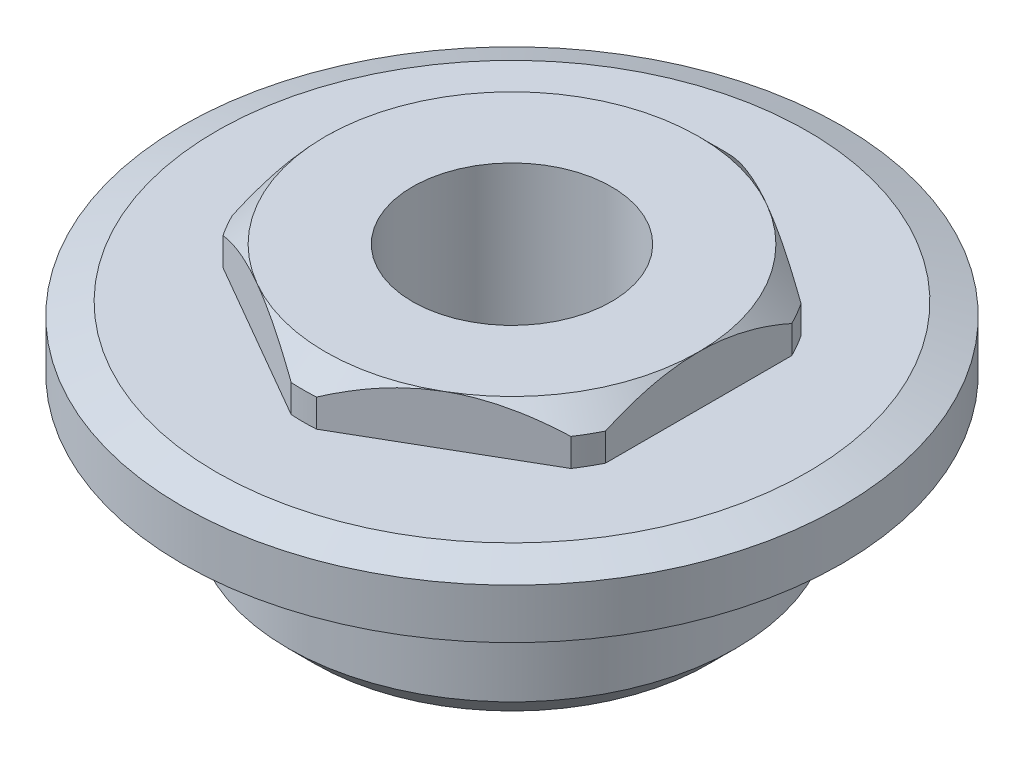
ISO-10303-21;
HEADER;
FILE_DESCRIPTION(('STEP AP214'),'2;1');
FILE_NAME('part.step','',(''),(''),'','','');
FILE_SCHEMA(('AUTOMOTIVE_DESIGN { 1 0 10303 214 1 1 1 1 }'));
ENDSEC;
DATA;
#1=APPLICATION_CONTEXT('core data for automotive mechanical design processes');
#2=APPLICATION_PROTOCOL_DEFINITION('international standard','automotive_design',2000,#1);
#3=PRODUCT_CONTEXT('',#1,'mechanical');
#4=PRODUCT('Part','Part','',(#3));
#5=PRODUCT_RELATED_PRODUCT_CATEGORY('part','',(#4));
#6=PRODUCT_DEFINITION_FORMATION('','',#4);
#7=PRODUCT_DEFINITION_CONTEXT('part definition',#1,'design');
#8=PRODUCT_DEFINITION('design','',#6,#7);
#9=PRODUCT_DEFINITION_SHAPE('','',#8);
#10=(LENGTH_UNIT() NAMED_UNIT(*) SI_UNIT(.MILLI.,.METRE.));
#11=(NAMED_UNIT(*) PLANE_ANGLE_UNIT() SI_UNIT($,.RADIAN.));
#12=(NAMED_UNIT(*) SI_UNIT($,.STERADIAN.) SOLID_ANGLE_UNIT());
#13=UNCERTAINTY_MEASURE_WITH_UNIT(LENGTH_MEASURE(1.E-05),#10,'distance_accuracy_value','');
#14=(GEOMETRIC_REPRESENTATION_CONTEXT(3) GLOBAL_UNCERTAINTY_ASSIGNED_CONTEXT((#13)) GLOBAL_UNIT_ASSIGNED_CONTEXT((#10,
#11,#12)) REPRESENTATION_CONTEXT('',''));
#15=CARTESIAN_POINT('',(0.,0.,0.));
#16=DIRECTION('',(0.,0.,1.));
#17=DIRECTION('',(1.,0.,0.));
#18=AXIS2_PLACEMENT_3D('',#15,#16,#17);
#19=CARTESIAN_POINT('',(0.,0.,0.));
#20=DIRECTION('',(0.,1.,0.));
#21=DIRECTION('',(0.,0.,1.));
#22=AXIS2_PLACEMENT_3D('',#19,#20,#21);
#23=CYLINDRICAL_SURFACE('',#22,16.765);
#24=DIRECTION('',(0.,1.,0.));
#25=VECTOR('',#24,1.);
#26=CARTESIAN_POINT('',(-13.9845137635755,0.,-9.24654528980244));
#27=LINE('',#26,#25);
#28=CARTESIAN_POINT('',(-13.9845137635755,17.3,-9.24654528980244));
#29=VERTEX_POINT('',#28);
#30=CARTESIAN_POINT('',(-13.9845137635755,19.535,-9.24654528980244));
#31=VERTEX_POINT('',#30);
#32=EDGE_CURVE('E173',#29,#31,#27,.T.);
#33=ORIENTED_EDGE('',*,*,#32,.F.);
#34=CARTESIAN_POINT('',(0.,17.3,0.));
#35=DIRECTION('',(0.,1.,0.));
#36=DIRECTION('',(0.,0.,1.));
#37=AXIS2_PLACEMENT_3D('',#34,#35,#36);
#38=CIRCLE('',#37,16.765);
#39=CARTESIAN_POINT('',(-15.,17.3,-7.48767153392829));
#40=VERTEX_POINT('',#39);
#41=EDGE_CURVE('E165',#29,#40,#38,.T.);
#42=ORIENTED_EDGE('',*,*,#41,.T.);
#43=DIRECTION('',(0.,1.,0.));
#44=VECTOR('',#43,1.);
#45=CARTESIAN_POINT('',(-15.,0.,-7.48767153392829));
#46=LINE('',#45,#44);
#47=CARTESIAN_POINT('',(-15.,19.535,-7.48767153392829));
#48=VERTEX_POINT('',#47);
#49=EDGE_CURVE('E146',#48,#40,#46,.F.);
#50=ORIENTED_EDGE('',*,*,#49,.F.);
#51=CARTESIAN_POINT('',(0.,19.535,0.));
#52=DIRECTION('',(0.,1.,0.));
#53=DIRECTION('',(0.,0.,1.));
#54=AXIS2_PLACEMENT_3D('',#51,#52,#53);
#55=CIRCLE('',#54,16.765);
#56=EDGE_CURVE('E305',#31,#48,#55,.T.);
#57=ORIENTED_EDGE('',*,*,#56,.F.);
#58=EDGE_LOOP('',(#33,#42,#50,#57));
#59=FACE_BOUND('',#58,.T.);
#60=ADVANCED_FACE('F37',(#59),#23,.T.);
#61=DIRECTION('',(0.,1.,0.));
#62=VECTOR('',#61,1.);
#63=CARTESIAN_POINT('',(-1.01548623642451,0.,-16.7342168237307));
#64=LINE('',#63,#62);
#65=CARTESIAN_POINT('',(-1.0154862364245,19.535,-16.7342168237307));
#66=VERTEX_POINT('',#65);
#67=CARTESIAN_POINT('',(-1.01548623642451,17.3,-16.7342168237307));
#68=VERTEX_POINT('',#67);
#69=EDGE_CURVE('E337',#66,#68,#64,.F.);
#70=ORIENTED_EDGE('',*,*,#69,.F.);
#71=CARTESIAN_POINT('',(1.0154862364245,19.535,-16.7342168237307));
#72=VERTEX_POINT('',#71);
#73=EDGE_CURVE('E306',#72,#66,#55,.T.);
#74=ORIENTED_EDGE('',*,*,#73,.F.);
#75=DIRECTION('',(0.,1.,0.));
#76=VECTOR('',#75,1.);
#77=CARTESIAN_POINT('',(1.01548623642451,0.,-16.7342168237307));
#78=LINE('',#77,#76);
#79=CARTESIAN_POINT('',(1.01548623642451,17.3,-16.7342168237307));
#80=VERTEX_POINT('',#79);
#81=EDGE_CURVE('E335',#80,#72,#78,.T.);
#82=ORIENTED_EDGE('',*,*,#81,.F.);
#83=EDGE_CURVE('E174',#80,#68,#38,.T.);
#84=ORIENTED_EDGE('',*,*,#83,.T.);
#85=EDGE_LOOP('',(#70,#74,#82,#84));
#86=FACE_BOUND('',#85,.T.);
#87=ADVANCED_FACE('F281',(#86),#23,.T.);
#88=DIRECTION('',(0.,1.,0.));
#89=VECTOR('',#88,1.);
#90=CARTESIAN_POINT('',(13.9845137635755,0.,-9.24654528980244));
#91=LINE('',#90,#89);
#92=CARTESIAN_POINT('',(13.9845137635755,19.535,-9.24654528980244));
#93=VERTEX_POINT('',#92);
#94=CARTESIAN_POINT('',(13.9845137635755,17.3,-9.24654528980244));
#95=VERTEX_POINT('',#94);
#96=EDGE_CURVE('E341',#93,#95,#91,.F.);
#97=ORIENTED_EDGE('',*,*,#96,.F.);
#98=CARTESIAN_POINT('',(15.,19.535,-7.48767153392829));
#99=VERTEX_POINT('',#98);
#100=EDGE_CURVE('E316',#99,#93,#55,.T.);
#101=ORIENTED_EDGE('',*,*,#100,.F.);
#102=DIRECTION('',(0.,1.,0.));
#103=VECTOR('',#102,1.);
#104=CARTESIAN_POINT('',(15.,0.,-7.48767153392829));
#105=LINE('',#104,#103);
#106=CARTESIAN_POINT('',(15.,17.3,-7.48767153392829));
#107=VERTEX_POINT('',#106);
#108=EDGE_CURVE('E345',#107,#99,#105,.T.);
#109=ORIENTED_EDGE('',*,*,#108,.F.);
#110=EDGE_CURVE('E177',#107,#95,#38,.T.);
#111=ORIENTED_EDGE('',*,*,#110,.T.);
#112=EDGE_LOOP('',(#97,#101,#109,#111));
#113=FACE_BOUND('',#112,.T.);
#114=ADVANCED_FACE('F285',(#113),#23,.T.);
#115=DIRECTION('',(0.,1.,0.));
#116=VECTOR('',#115,1.);
#117=CARTESIAN_POINT('',(15.,0.,7.48767153392829));
#118=LINE('',#117,#116);
#119=CARTESIAN_POINT('',(15.,19.535,7.48767153392829));
#120=VERTEX_POINT('',#119);
#121=CARTESIAN_POINT('',(15.,17.3,7.48767153392829));
#122=VERTEX_POINT('',#121);
#123=EDGE_CURVE('E347',#120,#122,#118,.F.);
#124=ORIENTED_EDGE('',*,*,#123,.F.);
#125=CARTESIAN_POINT('',(13.9845137635755,19.535,9.24654528980244));
#126=VERTEX_POINT('',#125);
#127=EDGE_CURVE('E182',#126,#120,#55,.T.);
#128=ORIENTED_EDGE('',*,*,#127,.F.);
#129=DIRECTION('',(0.,1.,0.));
#130=VECTOR('',#129,1.);
#131=CARTESIAN_POINT('',(13.9845137635755,0.,9.24654528980244));
#132=LINE('',#131,#130);
#133=CARTESIAN_POINT('',(13.9845137635755,17.3,9.24654528980244));
#134=VERTEX_POINT('',#133);
#135=EDGE_CURVE('E349',#134,#126,#132,.T.);
#136=ORIENTED_EDGE('',*,*,#135,.F.);
#137=EDGE_CURVE('E183',#134,#122,#38,.T.);
#138=ORIENTED_EDGE('',*,*,#137,.T.);
#139=EDGE_LOOP('',(#124,#128,#136,#138));
#140=FACE_BOUND('',#139,.T.);
#141=ADVANCED_FACE('F293',(#140),#23,.T.);
#142=DIRECTION('',(0.,1.,0.));
#143=VECTOR('',#142,1.);
#144=CARTESIAN_POINT('',(1.01548623642451,0.,16.7342168237307));
#145=LINE('',#144,#143);
#146=CARTESIAN_POINT('',(1.0154862364245,19.535,16.7342168237307));
#147=VERTEX_POINT('',#146);
#148=CARTESIAN_POINT('',(1.01548623642451,17.3,16.7342168237307));
#149=VERTEX_POINT('',#148);
#150=EDGE_CURVE('E351',#147,#149,#145,.F.);
#151=ORIENTED_EDGE('',*,*,#150,.F.);
#152=CARTESIAN_POINT('',(-1.0154862364245,19.535,16.7342168237307));
#153=VERTEX_POINT('',#152);
#154=EDGE_CURVE('E184',#153,#147,#55,.T.);
#155=ORIENTED_EDGE('',*,*,#154,.F.);
#156=DIRECTION('',(0.,1.,0.));
#157=VECTOR('',#156,1.);
#158=CARTESIAN_POINT('',(-1.01548623642451,0.,16.7342168237307));
#159=LINE('',#158,#157);
#160=CARTESIAN_POINT('',(-1.01548623642451,17.3,16.7342168237307));
#161=VERTEX_POINT('',#160);
#162=EDGE_CURVE('E300',#161,#153,#159,.T.);
#163=ORIENTED_EDGE('',*,*,#162,.F.);
#164=EDGE_CURVE('E178',#161,#149,#38,.T.);
#165=ORIENTED_EDGE('',*,*,#164,.T.);
#166=EDGE_LOOP('',(#151,#155,#163,#165));
#167=FACE_BOUND('',#166,.T.);
#168=ADVANCED_FACE('F288',(#167),#23,.T.);
#169=DIRECTION('',(0.,1.,0.));
#170=VECTOR('',#169,1.);
#171=CARTESIAN_POINT('',(-13.9845137635755,0.,9.24654528980244));
#172=LINE('',#171,#170);
#173=CARTESIAN_POINT('',(-13.9845137635755,19.535,9.24654528980244));
#174=VERTEX_POINT('',#173);
#175=CARTESIAN_POINT('',(-13.9845137635755,17.3,9.24654528980244));
#176=VERTEX_POINT('',#175);
#177=EDGE_CURVE('E297',#174,#176,#172,.F.);
#178=ORIENTED_EDGE('',*,*,#177,.F.);
#179=CARTESIAN_POINT('',(-15.,19.535,7.48767153392829));
#180=VERTEX_POINT('',#179);
#181=EDGE_CURVE('E299',#180,#174,#55,.T.);
#182=ORIENTED_EDGE('',*,*,#181,.F.);
#183=DIRECTION('',(0.,1.,0.));
#184=VECTOR('',#183,1.);
#185=CARTESIAN_POINT('',(-15.,0.,7.48767153392829));
#186=LINE('',#185,#184);
#187=CARTESIAN_POINT('',(-15.,17.3,7.48767153392829));
#188=VERTEX_POINT('',#187);
#189=EDGE_CURVE('E156',#188,#180,#186,.T.);
#190=ORIENTED_EDGE('',*,*,#189,.F.);
#191=EDGE_CURVE('E168',#188,#176,#38,.T.);
#192=ORIENTED_EDGE('',*,*,#191,.T.);
#193=EDGE_LOOP('',(#178,#182,#190,#192));
#194=FACE_BOUND('',#193,.T.);
#195=ADVANCED_FACE('F233',(#194),#23,.T.);
#196=CARTESIAN_POINT('',(0.,19.535,0.));
#197=DIRECTION('',(0.,-1.,0.));
#198=DIRECTION('',(0.,0.,-1.));
#199=AXIS2_PLACEMENT_3D('',#196,#197,#198);
#200=CONICAL_SURFACE('',#199,16.765,0.785398163397449);
#201=CARTESIAN_POINT('',(-13.9849015628612,19.5348,-9.24632139378042));
#202=CARTESIAN_POINT('',(-13.7539748505963,19.6538802713569,-9.37964699326966));
#203=CARTESIAN_POINT('',(-13.5214356455137,19.768734285981,-9.51390356592121));
#204=CARTESIAN_POINT('',(-13.0529017099638,19.9889092191457,-9.78441175973544));
#205=CARTESIAN_POINT('',(-12.8169057241301,20.0942265693545,-9.92066410568421));
#206=CARTESIAN_POINT('',(-12.1019807858625,20.3948228354741,-10.3334262112434));
#207=CARTESIAN_POINT('',(-11.6177312426382,20.5738953515338,-10.6130078153789));
#208=CARTESIAN_POINT('',(-10.8850054586592,20.8014534615381,-11.0360472440014));
#209=CARTESIAN_POINT('',(-10.6411582596428,20.8701779719215,-11.1768324899946));
#210=CARTESIAN_POINT('',(-10.1507844169757,20.9933811160152,-11.459949960062));
#211=CARTESIAN_POINT('',(-9.90425818209509,21.0478618921238,-11.6022819481326));
#212=CARTESIAN_POINT('',(-9.40938059281569,21.1414496525668,-11.887999657519));
#213=CARTESIAN_POINT('',(-9.16103234677124,21.1805784757967,-12.0313835842255));
#214=CARTESIAN_POINT('',(-8.66282338177515,21.2427382256803,-12.3190246642787));
#215=CARTESIAN_POINT('',(-8.41296270608967,21.2657696106599,-12.4632817926456));
#216=CARTESIAN_POINT('',(-7.93001655268986,21.2941840216632,-12.7421108843151));
#217=CARTESIAN_POINT('',(-7.69698031310247,21.300688932605,-12.8766544199718));
#218=CARTESIAN_POINT('',(-7.23095482903326,21.2991956599933,-13.1457143586484));
#219=CARTESIAN_POINT('',(-6.99796558259301,21.2911983298174,-13.280230762799));
#220=CARTESIAN_POINT('',(-6.532588419782,21.2608561714694,-13.5489163930226));
#221=CARTESIAN_POINT('',(-6.30020081913641,21.2385049248819,-13.6830854368117));
#222=CARTESIAN_POINT('',(-5.8367200412996,21.1798842907221,-13.95067618866));
#223=CARTESIAN_POINT('',(-5.60562705854819,21.1436128664679,-14.0840977844593));
#224=CARTESIAN_POINT('',(-5.1453871787927,21.0578371680366,-14.349817402928));
#225=CARTESIAN_POINT('',(-4.91623956329583,21.0083380201658,-14.4821158404192));
#226=CARTESIAN_POINT('',(-4.46020506085322,20.8969420201502,-14.7454074831642));
#227=CARTESIAN_POINT('',(-4.23331855832311,20.8350430964093,-14.8764004664755));
#228=CARTESIAN_POINT('',(-3.55644794638069,20.6321206326367,-15.267191896487));
#229=CARTESIAN_POINT('',(-3.11025052847152,20.4738709731961,-15.5248040958286));
#230=CARTESIAN_POINT('',(-2.52950377871176,20.2401767365576,-15.8600983881334));
#231=CARTESIAN_POINT('',(-2.38958796244081,20.1817036293655,-15.9408788223213));
#232=CARTESIAN_POINT('',(-2.11097510790584,20.0611606130715,-16.1017360288867));
#233=CARTESIAN_POINT('',(-1.97227759703095,19.9990921767134,-16.1818130741263));
#234=CARTESIAN_POINT('',(-1.6965248642645,19.8717966727106,-16.3410189886188));
#235=CARTESIAN_POINT('',(-1.55946566869665,19.8065810273583,-16.4201501520748));
#236=CARTESIAN_POINT('',(-1.28644836772458,19.6729961569789,-16.5777767642844));
#237=CARTESIAN_POINT('',(-1.1504906582804,19.6046258523259,-16.6562719844304));
#238=CARTESIAN_POINT('',(-1.01509843713877,19.5348,-16.7344407197527));
#239=B_SPLINE_CURVE_WITH_KNOTS('',3,(#201,#202,#203,#204,#205,#206,#207,#208,#209,#210,#211,
#212,#213,#214,#215,#216,#217,#218,#219,#220,#221,#222,#223,#224,#225,#226,#227,#228,#229,#230,
#231,#232,#233,#234,#235,#236,#237,#238),.UNSPECIFIED.,.F.,.F.,(4,2,2,2,2,2,2,2,2,2,2,2,2,2,2,2,
2,2,4),(0.,0.87599309360297,1.75231261457009,3.5110912225386,4.38030830352504,5.24939457035415,
6.11723999802393,6.98506071541996,7.79217287194938,8.59923753588322,9.40666333376713,
10.2142073123893,11.021438786036,11.8288052342371,13.4435304160356,13.958971987169,
14.4742038924733,14.9876889837408,15.5013511287846),.UNSPECIFIED.);
#240=CARTESIAN_POINT('',(-7.5,21.3,-12.9903810567666));
#241=VERTEX_POINT('',#240);
#242=EDGE_CURVE('E11',#31,#241,#239,.T.);
#243=ORIENTED_EDGE('',*,*,#242,.F.);
#244=ORIENTED_EDGE('',*,*,#56,.T.);
#245=CARTESIAN_POINT('',(-15.,12.9844626941357,-17.8497697425247));
#246=CARTESIAN_POINT('',(-15.,13.1498596592745,-17.6337229661297));
#247=CARTESIAN_POINT('',(-15.,13.3144766424375,-17.4170795222981));
#248=CARTESIAN_POINT('',(-15.,13.6420020812144,-16.9824994650326));
#249=CARTESIAN_POINT('',(-15.,13.8049105076196,-16.7645628295902));
#250=CARTESIAN_POINT('',(-15.,14.290914296738,-16.1085764351286));
#251=CARTESIAN_POINT('',(-15.,14.6112138676487,-15.6684469792901));
#252=CARTESIAN_POINT('',(-15.,15.2452759714669,-14.778353624162));
#253=CARTESIAN_POINT('',(-15.,15.558968872616,-14.3283400137623));
#254=CARTESIAN_POINT('',(-15.,16.1752296074137,-13.4207813037928));
#255=CARTESIAN_POINT('',(-15.,16.4777982121606,-12.9632367294385));
#256=CARTESIAN_POINT('',(-15.,17.0875206574449,-12.010886308375));
#257=CARTESIAN_POINT('',(-15.,17.3938071054855,-11.5155223586127));
#258=CARTESIAN_POINT('',(-15.,17.9870634930767,-10.5131769544914));
#259=CARTESIAN_POINT('',(-15.,18.2740302342276,-10.006193595057));
#260=CARTESIAN_POINT('',(-15.,18.8225127224507,-8.9805244870873));
#261=CARTESIAN_POINT('',(-15.,19.0841032376205,-8.46187902978199));
#262=CARTESIAN_POINT('',(-15.,19.5759737726056,-7.41005761042753));
#263=CARTESIAN_POINT('',(-15.,19.8062684022982,-6.87688856894992));
#264=CARTESIAN_POINT('',(-15.,20.2074872839611,-5.84574960875241));
#265=CARTESIAN_POINT('',(-15.,20.381954416596,-5.34916976082462));
#266=CARTESIAN_POINT('',(-15.,20.691121283338,-4.34345402016277));
#267=CARTESIAN_POINT('',(-15.,20.8258184312869,-3.83431731321425));
#268=CARTESIAN_POINT('',(-15.,20.9914739492615,-3.06786619474571));
#269=CARTESIAN_POINT('',(-15.,21.0403294856017,-2.81434889807611));
#270=CARTESIAN_POINT('',(-15.,21.1259599434333,-2.30529358298032));
#271=CARTESIAN_POINT('',(-15.,21.162736519314,-2.04975584619665));
#272=CARTESIAN_POINT('',(-15.,21.2235881262218,-1.53718971128668));
#273=CARTESIAN_POINT('',(-15.,21.2476641741596,-1.28016143417207));
#274=CARTESIAN_POINT('',(-15.,21.2826910285218,-0.765208517014767));
#275=CARTESIAN_POINT('',(-15.,21.2936419942966,-0.507283887892735));
#276=CARTESIAN_POINT('',(-15.,21.3020383306884,-0.00194461429973888));
#277=CARTESIAN_POINT('',(-15.,21.3000263045342,0.245461133239634));
#278=CARTESIAN_POINT('',(-15.,21.2837958629145,0.73989752073958));
#279=CARTESIAN_POINT('',(-15.,21.2695760904343,0.986928115939867));
#280=CARTESIAN_POINT('',(-15.,21.2291664474353,1.47999320548817));
#281=CARTESIAN_POINT('',(-15.,21.202977250872,1.72602775513317));
#282=CARTESIAN_POINT('',(-15.,21.1390593461273,2.21660452731652));
#283=CARTESIAN_POINT('',(-15.,21.1013291154732,2.46114654861948));
#284=CARTESIAN_POINT('',(-15.,20.9701132458133,3.20048232976758));
#285=CARTESIAN_POINT('',(-15.,20.8593420450259,3.6922845143982));
#286=CARTESIAN_POINT('',(-15.,20.5983349535809,4.66500464002318));
#287=CARTESIAN_POINT('',(-15.,20.4481016060419,5.14592328023373));
#288=CARTESIAN_POINT('',(-15.,20.1035102692536,6.12794386525669));
#289=CARTESIAN_POINT('',(-15.,19.9068693582531,6.62823746036044));
#290=CARTESIAN_POINT('',(-15.,19.4832525792488,7.61591927450151));
#291=CARTESIAN_POINT('',(-15.,19.2562629176829,8.10330150390043));
#292=CARTESIAN_POINT('',(-15.,18.777335581914,9.06749097703823));
#293=CARTESIAN_POINT('',(-15.,18.5253206758544,9.54425955163095));
#294=CARTESIAN_POINT('',(-15.,18.001895201585,10.4868600967723));
#295=CARTESIAN_POINT('',(-15.,17.7304876443099,10.9526937502382));
#296=CARTESIAN_POINT('',(-15.,17.1858786707374,11.8520554067509));
#297=CARTESIAN_POINT('',(-15.,16.9134300198266,12.2860416346536));
#298=CARTESIAN_POINT('',(-15.,16.3569729071603,13.1465596076531));
#299=CARTESIAN_POINT('',(-15.,16.0729635763073,13.5730907888435));
#300=CARTESIAN_POINT('',(-15.,15.4977502415351,14.416234517208));
#301=CARTESIAN_POINT('',(-15.,15.2066225917641,14.8328992775271));
#302=CARTESIAN_POINT('',(-15.,14.7641149532041,15.4536517732037));
#303=CARTESIAN_POINT('',(-15.,14.6156624142021,15.659835719205));
#304=CARTESIAN_POINT('',(-15.,14.3169661119064,16.0708959370313));
#305=CARTESIAN_POINT('',(-15.,14.1667223852283,16.2757722354564));
#306=CARTESIAN_POINT('',(-15.,14.0156595693924,16.4800433381473));
#307=B_SPLINE_CURVE_WITH_KNOTS('',3,(#245,#246,#247,#248,#249,#250,#251,#252,#253,#254,#255,
#256,#257,#258,#259,#260,#261,#262,#263,#264,#265,#266,#267,#268,#269,#270,#271,#272,#273,#274,
#275,#276,#277,#278,#279,#280,#281,#282,#283,#284,#285,#286,#287,#288,#289,#290,#291,#292,#293,
#294,#295,#296,#297,#298,#299,#300,#301,#302,#303,#304,#305,#306),.UNSPECIFIED.,.F.,.F.,(4,2,2,
2,2,2,2,2,2,2,2,2,2,2,2,2,2,2,2,2,2,2,2,2,2,2,2,2,2,2,4),(0.,0.816263395485582,1.63254072276588,
3.26546139852228,4.91099909653635,6.55642251562046,8.30329096390873,10.0504479007205,
11.7922898611169,13.5333158623466,15.1110150221548,16.6888167538276,17.4631207974658,
18.2373187446444,19.0114546936459,19.7855812438431,20.5275212305694,21.2695437021228,
22.0115243981795,22.7536030172499,24.2638564916747,25.7740126624306,27.3854102544543,
28.9975427351771,30.6148150074971,32.2318367228443,33.7688749498773,35.3060289410418,
36.8308045953629,37.5929973878878,38.3551746261912),.UNSPECIFIED.);
#308=CARTESIAN_POINT('',(-15.,21.3,0.));
#309=VERTEX_POINT('',#308);
#310=EDGE_CURVE('E151',#309,#48,#307,.F.);
#311=ORIENTED_EDGE('',*,*,#310,.F.);
#312=CARTESIAN_POINT('',(0.,21.3,0.));
#313=DIRECTION('',(0.,1.,0.));
#314=DIRECTION('',(0.,0.,1.));
#315=AXIS2_PLACEMENT_3D('',#312,#313,#314);
#316=CIRCLE('',#315,15.);
#317=EDGE_CURVE('E388',#241,#309,#316,.T.);
#318=ORIENTED_EDGE('',*,*,#317,.F.);
#319=EDGE_LOOP('',(#243,#244,#311,#318));
#320=FACE_BOUND('',#319,.T.);
#321=ADVANCED_FACE('F228',(#320),#200,.T.);
#322=EDGE_CURVE('E41',#241,#66,#239,.T.);
#323=ORIENTED_EDGE('',*,*,#322,.F.);
#324=CARTESIAN_POINT('',(7.5,21.3,-12.9903810567666));
#325=VERTEX_POINT('',#324);
#326=EDGE_CURVE('E389',#325,#241,#316,.T.);
#327=ORIENTED_EDGE('',*,*,#326,.F.);
#328=CARTESIAN_POINT('',(1.01509843713877,19.5348,-16.7344407197527));
#329=CARTESIAN_POINT('',(1.2460251494037,19.6538802713569,-16.6011151202635));
#330=CARTESIAN_POINT('',(1.47856435448625,19.768734285981,-16.4668585476119));
#331=CARTESIAN_POINT('',(1.94709829003619,19.9889092191457,-16.1963503537977));
#332=CARTESIAN_POINT('',(2.18309427586991,20.0942265693545,-16.060098007849));
#333=CARTESIAN_POINT('',(2.89801921413754,20.3948228354741,-15.6473359022898));
#334=CARTESIAN_POINT('',(3.38226875736185,20.5738953515338,-15.3677542981542));
#335=CARTESIAN_POINT('',(4.11499454134083,20.8014534615381,-14.9447148695318));
#336=CARTESIAN_POINT('',(4.35884174035723,20.8701779719215,-14.8039296235385));
#337=CARTESIAN_POINT('',(4.84921558302431,20.9933811160152,-14.5208121534712));
#338=CARTESIAN_POINT('',(5.09574181790491,21.0478618921238,-14.3784801654005));
#339=CARTESIAN_POINT('',(5.59061940718431,21.1414496525668,-14.0927624560142));
#340=CARTESIAN_POINT('',(5.83896765322876,21.1805784757967,-13.9493785293076));
#341=CARTESIAN_POINT('',(6.33717661822486,21.2427382256803,-13.6617374492544));
#342=CARTESIAN_POINT('',(6.58703729391033,21.2657696106599,-13.5174803208875));
#343=CARTESIAN_POINT('',(7.06998344731015,21.2941840216632,-13.2386512292181));
#344=CARTESIAN_POINT('',(7.30301968689753,21.300688932605,-13.1041076935613));
#345=CARTESIAN_POINT('',(7.76904517096674,21.2991956599933,-12.8350477548848));
#346=CARTESIAN_POINT('',(8.00203441740699,21.2911983298174,-12.7005313507342));
#347=CARTESIAN_POINT('',(8.46741158021801,21.2608561714694,-12.4318457205106));
#348=CARTESIAN_POINT('',(8.69979918086359,21.2385049248819,-12.2976766767215));
#349=CARTESIAN_POINT('',(9.16327995870039,21.1798842907221,-12.0300859248732));
#350=CARTESIAN_POINT('',(9.39437294145181,21.1436128664679,-11.8966643290738));
#351=CARTESIAN_POINT('',(9.8546128212073,21.0578371680366,-11.6309447106052));
#352=CARTESIAN_POINT('',(10.0837604367042,21.0083380201658,-11.4986462731139));
#353=CARTESIAN_POINT('',(10.5397949391468,20.8969420201502,-11.2353546303689));
#354=CARTESIAN_POINT('',(10.7666814416769,20.8350430964093,-11.1043616470577));
#355=CARTESIAN_POINT('',(11.4435520536193,20.6321206326367,-10.7135702170462));
#356=CARTESIAN_POINT('',(11.8897494715285,20.4738709731961,-10.4559580177046));
#357=CARTESIAN_POINT('',(12.4704962212882,20.2401767365576,-10.1206637253998));
#358=CARTESIAN_POINT('',(12.6104120375592,20.1817036293655,-10.0398832912119));
#359=CARTESIAN_POINT('',(12.8890248920942,20.0611606130715,-9.87902608464643));
#360=CARTESIAN_POINT('',(13.0277224029691,19.9990921767134,-9.79894903940687));
#361=CARTESIAN_POINT('',(13.3034751357355,19.8717966727106,-9.63974312491439));
#362=CARTESIAN_POINT('',(13.4405343313034,19.8065810273583,-9.56061196145837));
#363=CARTESIAN_POINT('',(13.7135516322754,19.6729961569789,-9.40298534924873));
#364=CARTESIAN_POINT('',(13.8495093417196,19.6046258523259,-9.32449012910272));
#365=CARTESIAN_POINT('',(13.9849015628612,19.5348,-9.24632139378042));
#366=B_SPLINE_CURVE_WITH_KNOTS('',3,(#328,#329,#330,#331,#332,#333,#334,#335,#336,#337,#338,
#339,#340,#341,#342,#343,#344,#345,#346,#347,#348,#349,#350,#351,#352,#353,#354,#355,#356,#357,
#358,#359,#360,#361,#362,#363,#364,#365),.UNSPECIFIED.,.F.,.F.,(4,2,2,2,2,2,2,2,2,2,2,2,2,2,2,2,
2,2,4),(0.,0.875993093602971,1.75231261457009,3.5110912225386,4.38030830352504,5.24939457035415,
6.11723999802393,6.98506071541996,7.79217287194937,8.59923753588322,9.40666333376713,
10.2142073123893,11.021438786036,11.8288052342371,13.4435304160356,13.958971987169,
14.4742038924733,14.9876889837408,15.5013511287846),.UNSPECIFIED.);
#367=EDGE_CURVE('E260',#72,#325,#366,.T.);
#368=ORIENTED_EDGE('',*,*,#367,.F.);
#369=ORIENTED_EDGE('',*,*,#73,.T.);
#370=EDGE_LOOP('',(#323,#327,#368,#369));
#371=FACE_BOUND('',#370,.T.);
#372=ADVANCED_FACE('F232',(#371),#200,.T.);
#373=EDGE_CURVE('E255',#325,#93,#366,.T.);
#374=ORIENTED_EDGE('',*,*,#373,.F.);
#375=CARTESIAN_POINT('',(15.,21.3,0.));
#376=VERTEX_POINT('',#375);
#377=EDGE_CURVE('E313',#376,#325,#316,.T.);
#378=ORIENTED_EDGE('',*,*,#377,.F.);
#379=CARTESIAN_POINT('',(15.,12.9844626941357,-17.8497697425247));
#380=CARTESIAN_POINT('',(15.,13.1498596592745,-17.6337229661297));
#381=CARTESIAN_POINT('',(15.,13.3144766424375,-17.4170795222981));
#382=CARTESIAN_POINT('',(15.,13.6420020812144,-16.9824994650326));
#383=CARTESIAN_POINT('',(15.,13.8049105076196,-16.7645628295902));
#384=CARTESIAN_POINT('',(15.,14.290914296738,-16.1085764351286));
#385=CARTESIAN_POINT('',(15.,14.6112138676487,-15.6684469792901));
#386=CARTESIAN_POINT('',(15.,15.2452759714669,-14.778353624162));
#387=CARTESIAN_POINT('',(15.,15.558968872616,-14.3283400137623));
#388=CARTESIAN_POINT('',(15.,16.1752296074137,-13.4207813037928));
#389=CARTESIAN_POINT('',(15.,16.4777982121606,-12.9632367294385));
#390=CARTESIAN_POINT('',(15.,17.0875206574449,-12.010886308375));
#391=CARTESIAN_POINT('',(15.,17.3938071054855,-11.5155223586127));
#392=CARTESIAN_POINT('',(15.,17.9870634930767,-10.5131769544914));
#393=CARTESIAN_POINT('',(15.,18.2740302342276,-10.006193595057));
#394=CARTESIAN_POINT('',(15.,18.8225127224507,-8.9805244870873));
#395=CARTESIAN_POINT('',(15.,19.0841032376205,-8.46187902978199));
#396=CARTESIAN_POINT('',(15.,19.5759737726056,-7.41005761042753));
#397=CARTESIAN_POINT('',(15.,19.8062684022982,-6.87688856894992));
#398=CARTESIAN_POINT('',(15.,20.2074872839611,-5.84574960875241));
#399=CARTESIAN_POINT('',(15.,20.381954416596,-5.34916976082462));
#400=CARTESIAN_POINT('',(15.,20.691121283338,-4.34345402016277));
#401=CARTESIAN_POINT('',(15.,20.8258184312869,-3.83431731321425));
#402=CARTESIAN_POINT('',(15.,20.9914739492615,-3.06786619474571));
#403=CARTESIAN_POINT('',(15.,21.0403294856017,-2.81434889807611));
#404=CARTESIAN_POINT('',(15.,21.1259599434333,-2.30529358298032));
#405=CARTESIAN_POINT('',(15.,21.162736519314,-2.04975584619665));
#406=CARTESIAN_POINT('',(15.,21.2235881262218,-1.53718971128668));
#407=CARTESIAN_POINT('',(15.,21.2476641741596,-1.28016143417207));
#408=CARTESIAN_POINT('',(15.,21.2826910285218,-0.765208517014767));
#409=CARTESIAN_POINT('',(15.,21.2936419942966,-0.507283887892735));
#410=CARTESIAN_POINT('',(15.,21.3020383306884,-0.00194461429973888));
#411=CARTESIAN_POINT('',(15.,21.3000263045342,0.245461133239634));
#412=CARTESIAN_POINT('',(15.,21.2837958629145,0.73989752073958));
#413=CARTESIAN_POINT('',(15.,21.2695760904343,0.986928115939867));
#414=CARTESIAN_POINT('',(15.,21.2291664474353,1.47999320548817));
#415=CARTESIAN_POINT('',(15.,21.202977250872,1.72602775513317));
#416=CARTESIAN_POINT('',(15.,21.1390593461273,2.21660452731652));
#417=CARTESIAN_POINT('',(15.,21.1013291154732,2.46114654861948));
#418=CARTESIAN_POINT('',(15.,20.9701132458133,3.20048232976758));
#419=CARTESIAN_POINT('',(15.,20.8593420450259,3.6922845143982));
#420=CARTESIAN_POINT('',(15.,20.5983349535809,4.66500464002318));
#421=CARTESIAN_POINT('',(15.,20.4481016060419,5.14592328023373));
#422=CARTESIAN_POINT('',(15.,20.1035102692536,6.12794386525669));
#423=CARTESIAN_POINT('',(15.,19.9068693582531,6.62823746036044));
#424=CARTESIAN_POINT('',(15.,19.4832525792488,7.61591927450151));
#425=CARTESIAN_POINT('',(15.,19.2562629176829,8.10330150390043));
#426=CARTESIAN_POINT('',(15.,18.777335581914,9.06749097703823));
#427=CARTESIAN_POINT('',(15.,18.5253206758544,9.54425955163095));
#428=CARTESIAN_POINT('',(15.,18.001895201585,10.4868600967723));
#429=CARTESIAN_POINT('',(15.,17.7304876443099,10.9526937502382));
#430=CARTESIAN_POINT('',(15.,17.1858786707374,11.8520554067509));
#431=CARTESIAN_POINT('',(15.,16.9134300198266,12.2860416346536));
#432=CARTESIAN_POINT('',(15.,16.3569729071603,13.1465596076531));
#433=CARTESIAN_POINT('',(15.,16.0729635763073,13.5730907888435));
#434=CARTESIAN_POINT('',(15.,15.4977502415351,14.416234517208));
#435=CARTESIAN_POINT('',(15.,15.2066225917641,14.8328992775271));
#436=CARTESIAN_POINT('',(15.,14.7641149532041,15.4536517732037));
#437=CARTESIAN_POINT('',(15.,14.6156624142021,15.659835719205));
#438=CARTESIAN_POINT('',(15.,14.3169661119064,16.0708959370313));
#439=CARTESIAN_POINT('',(15.,14.1667223852283,16.2757722354564));
#440=CARTESIAN_POINT('',(15.,14.0156595693924,16.4800433381473));
#441=B_SPLINE_CURVE_WITH_KNOTS('',3,(#379,#380,#381,#382,#383,#384,#385,#386,#387,#388,#389,
#390,#391,#392,#393,#394,#395,#396,#397,#398,#399,#400,#401,#402,#403,#404,#405,#406,#407,#408,
#409,#410,#411,#412,#413,#414,#415,#416,#417,#418,#419,#420,#421,#422,#423,#424,#425,#426,#427,
#428,#429,#430,#431,#432,#433,#434,#435,#436,#437,#438,#439,#440),.UNSPECIFIED.,.F.,.F.,(4,2,2,
2,2,2,2,2,2,2,2,2,2,2,2,2,2,2,2,2,2,2,2,2,2,2,2,2,2,2,4),(0.,0.816263395485582,1.63254072276588,
3.26546139852228,4.91099909653635,6.55642251562046,8.30329096390873,10.0504479007205,
11.7922898611169,13.5333158623466,15.1110150221548,16.6888167538276,17.4631207974658,
18.2373187446444,19.0114546936459,19.7855812438431,20.5275212305694,21.2695437021228,
22.0115243981795,22.7536030172499,24.2638564916747,25.7740126624306,27.3854102544543,
28.9975427351771,30.6148150074971,32.2318367228443,33.7688749498773,35.3060289410418,
36.8308045953629,37.5929973878878,38.3551746261912),.UNSPECIFIED.);
#442=EDGE_CURVE('E261',#99,#376,#441,.T.);
#443=ORIENTED_EDGE('',*,*,#442,.F.);
#444=ORIENTED_EDGE('',*,*,#100,.T.);
#445=EDGE_LOOP('',(#374,#378,#443,#444));
#446=FACE_BOUND('',#445,.T.);
#447=ADVANCED_FACE('F391',(#446),#200,.T.);
#448=EDGE_CURVE('E250',#376,#120,#441,.T.);
#449=ORIENTED_EDGE('',*,*,#448,.F.);
#450=CARTESIAN_POINT('',(7.5,21.3,12.9903810567666));
#451=VERTEX_POINT('',#450);
#452=EDGE_CURVE('E308',#451,#376,#316,.T.);
#453=ORIENTED_EDGE('',*,*,#452,.F.);
#454=CARTESIAN_POINT('',(13.9849015628612,19.5348,9.24632139378042));
#455=CARTESIAN_POINT('',(13.7539748505963,19.6538802713569,9.37964699326966));
#456=CARTESIAN_POINT('',(13.5214356455137,19.768734285981,9.51390356592121));
#457=CARTESIAN_POINT('',(13.0529017099638,19.9889092191457,9.78441175973544));
#458=CARTESIAN_POINT('',(12.8169057241301,20.0942265693545,9.92066410568421));
#459=CARTESIAN_POINT('',(12.1019807858625,20.3948228354741,10.3334262112434));
#460=CARTESIAN_POINT('',(11.6177312426382,20.5738953515338,10.6130078153789));
#461=CARTESIAN_POINT('',(10.8850054586592,20.8014534615381,11.0360472440014));
#462=CARTESIAN_POINT('',(10.6411582596428,20.8701779719215,11.1768324899946));
#463=CARTESIAN_POINT('',(10.1507844169757,20.9933811160152,11.459949960062));
#464=CARTESIAN_POINT('',(9.90425818209509,21.0478618921238,11.6022819481326));
#465=CARTESIAN_POINT('',(9.40938059281569,21.1414496525668,11.887999657519));
#466=CARTESIAN_POINT('',(9.16103234677124,21.1805784757967,12.0313835842255));
#467=CARTESIAN_POINT('',(8.66282338177515,21.2427382256803,12.3190246642787));
#468=CARTESIAN_POINT('',(8.41296270608967,21.2657696106599,12.4632817926456));
#469=CARTESIAN_POINT('',(7.93001655268986,21.2941840216632,12.7421108843151));
#470=CARTESIAN_POINT('',(7.69698031310247,21.300688932605,12.8766544199718));
#471=CARTESIAN_POINT('',(7.23095482903326,21.2991956599933,13.1457143586484));
#472=CARTESIAN_POINT('',(6.99796558259301,21.2911983298174,13.280230762799));
#473=CARTESIAN_POINT('',(6.532588419782,21.2608561714694,13.5489163930226));
#474=CARTESIAN_POINT('',(6.30020081913641,21.2385049248819,13.6830854368117));
#475=CARTESIAN_POINT('',(5.8367200412996,21.1798842907221,13.95067618866));
#476=CARTESIAN_POINT('',(5.60562705854819,21.1436128664679,14.0840977844593));
#477=CARTESIAN_POINT('',(5.1453871787927,21.0578371680366,14.349817402928));
#478=CARTESIAN_POINT('',(4.91623956329583,21.0083380201658,14.4821158404192));
#479=CARTESIAN_POINT('',(4.46020506085322,20.8969420201502,14.7454074831642));
#480=CARTESIAN_POINT('',(4.23331855832311,20.8350430964093,14.8764004664755));
#481=CARTESIAN_POINT('',(3.55644794638069,20.6321206326367,15.267191896487));
#482=CARTESIAN_POINT('',(3.11025052847152,20.4738709731961,15.5248040958286));
#483=CARTESIAN_POINT('',(2.52950377871176,20.2401767365576,15.8600983881334));
#484=CARTESIAN_POINT('',(2.38958796244081,20.1817036293655,15.9408788223213));
#485=CARTESIAN_POINT('',(2.11097510790584,20.0611606130715,16.1017360288867));
#486=CARTESIAN_POINT('',(1.97227759703095,19.9990921767134,16.1818130741263));
#487=CARTESIAN_POINT('',(1.6965248642645,19.8717966727106,16.3410189886188));
#488=CARTESIAN_POINT('',(1.55946566869665,19.8065810273583,16.4201501520748));
#489=CARTESIAN_POINT('',(1.28644836772458,19.6729961569789,16.5777767642844));
#490=CARTESIAN_POINT('',(1.1504906582804,19.6046258523259,16.6562719844304));
#491=CARTESIAN_POINT('',(1.01509843713877,19.5348,16.7344407197527));
#492=B_SPLINE_CURVE_WITH_KNOTS('',3,(#454,#455,#456,#457,#458,#459,#460,#461,#462,#463,#464,
#465,#466,#467,#468,#469,#470,#471,#472,#473,#474,#475,#476,#477,#478,#479,#480,#481,#482,#483,
#484,#485,#486,#487,#488,#489,#490,#491),.UNSPECIFIED.,.F.,.F.,(4,2,2,2,2,2,2,2,2,2,2,2,2,2,2,2,
2,2,4),(0.,0.87599309360297,1.75231261457009,3.5110912225386,4.38030830352504,5.24939457035415,
6.11723999802393,6.98506071541996,7.79217287194938,8.59923753588322,9.40666333376713,
10.2142073123893,11.021438786036,11.8288052342371,13.4435304160356,13.958971987169,
14.4742038924733,14.9876889837408,15.5013511287846),.UNSPECIFIED.);
#493=EDGE_CURVE('E378',#126,#451,#492,.T.);
#494=ORIENTED_EDGE('',*,*,#493,.F.);
#495=ORIENTED_EDGE('',*,*,#127,.T.);
#496=EDGE_LOOP('',(#449,#453,#494,#495));
#497=FACE_BOUND('',#496,.T.);
#498=ADVANCED_FACE('F393',(#497),#200,.T.);
#499=EDGE_CURVE('E244',#451,#147,#492,.T.);
#500=ORIENTED_EDGE('',*,*,#499,.F.);
#501=CARTESIAN_POINT('',(-7.5,21.3,12.9903810567666));
#502=VERTEX_POINT('',#501);
#503=EDGE_CURVE('E314',#502,#451,#316,.T.);
#504=ORIENTED_EDGE('',*,*,#503,.F.);
#505=CARTESIAN_POINT('',(-1.01509843713877,19.5348,16.7344407197527));
#506=CARTESIAN_POINT('',(-1.2460251494037,19.6538802713569,16.6011151202635));
#507=CARTESIAN_POINT('',(-1.47856435448625,19.768734285981,16.4668585476119));
#508=CARTESIAN_POINT('',(-1.94709829003619,19.9889092191457,16.1963503537977));
#509=CARTESIAN_POINT('',(-2.18309427586991,20.0942265693545,16.060098007849));
#510=CARTESIAN_POINT('',(-2.89801921413754,20.3948228354741,15.6473359022898));
#511=CARTESIAN_POINT('',(-3.38226875736185,20.5738953515338,15.3677542981542));
#512=CARTESIAN_POINT('',(-4.11499454134083,20.8014534615381,14.9447148695318));
#513=CARTESIAN_POINT('',(-4.35884174035723,20.8701779719215,14.8039296235385));
#514=CARTESIAN_POINT('',(-4.84921558302431,20.9933811160152,14.5208121534712));
#515=CARTESIAN_POINT('',(-5.09574181790491,21.0478618921238,14.3784801654005));
#516=CARTESIAN_POINT('',(-5.59061940718431,21.1414496525668,14.0927624560142));
#517=CARTESIAN_POINT('',(-5.83896765322876,21.1805784757967,13.9493785293076));
#518=CARTESIAN_POINT('',(-6.33717661822486,21.2427382256803,13.6617374492544));
#519=CARTESIAN_POINT('',(-6.58703729391033,21.2657696106599,13.5174803208875));
#520=CARTESIAN_POINT('',(-7.06998344731015,21.2941840216632,13.2386512292181));
#521=CARTESIAN_POINT('',(-7.30301968689753,21.300688932605,13.1041076935613));
#522=CARTESIAN_POINT('',(-7.76904517096674,21.2991956599933,12.8350477548848));
#523=CARTESIAN_POINT('',(-8.00203441740699,21.2911983298174,12.7005313507342));
#524=CARTESIAN_POINT('',(-8.46741158021801,21.2608561714694,12.4318457205106));
#525=CARTESIAN_POINT('',(-8.69979918086359,21.2385049248819,12.2976766767215));
#526=CARTESIAN_POINT('',(-9.16327995870039,21.1798842907221,12.0300859248732));
#527=CARTESIAN_POINT('',(-9.39437294145181,21.1436128664679,11.8966643290738));
#528=CARTESIAN_POINT('',(-9.8546128212073,21.0578371680366,11.6309447106052));
#529=CARTESIAN_POINT('',(-10.0837604367042,21.0083380201658,11.4986462731139));
#530=CARTESIAN_POINT('',(-10.5397949391468,20.8969420201502,11.2353546303689));
#531=CARTESIAN_POINT('',(-10.7666814416769,20.8350430964093,11.1043616470577));
#532=CARTESIAN_POINT('',(-11.4435520536193,20.6321206326367,10.7135702170462));
#533=CARTESIAN_POINT('',(-11.8897494715285,20.4738709731961,10.4559580177046));
#534=CARTESIAN_POINT('',(-12.4704962212882,20.2401767365576,10.1206637253998));
#535=CARTESIAN_POINT('',(-12.6104120375592,20.1817036293655,10.0398832912119));
#536=CARTESIAN_POINT('',(-12.8890248920942,20.0611606130715,9.87902608464643));
#537=CARTESIAN_POINT('',(-13.0277224029691,19.9990921767134,9.79894903940687));
#538=CARTESIAN_POINT('',(-13.3034751357355,19.8717966727106,9.63974312491439));
#539=CARTESIAN_POINT('',(-13.4405343313034,19.8065810273583,9.56061196145837));
#540=CARTESIAN_POINT('',(-13.7135516322754,19.6729961569789,9.40298534924873));
#541=CARTESIAN_POINT('',(-13.8495093417196,19.6046258523259,9.32449012910272));
#542=CARTESIAN_POINT('',(-13.9849015628612,19.5348,9.24632139378042));
#543=B_SPLINE_CURVE_WITH_KNOTS('',3,(#505,#506,#507,#508,#509,#510,#511,#512,#513,#514,#515,
#516,#517,#518,#519,#520,#521,#522,#523,#524,#525,#526,#527,#528,#529,#530,#531,#532,#533,#534,
#535,#536,#537,#538,#539,#540,#541,#542),.UNSPECIFIED.,.F.,.F.,(4,2,2,2,2,2,2,2,2,2,2,2,2,2,2,2,
2,2,4),(0.,0.875993093602971,1.75231261457009,3.5110912225386,4.38030830352504,5.24939457035415,
6.11723999802393,6.98506071541996,7.79217287194937,8.59923753588322,9.40666333376713,
10.2142073123893,11.021438786036,11.8288052342371,13.4435304160356,13.958971987169,
14.4742038924733,14.9876889837408,15.5013511287846),.UNSPECIFIED.);
#544=EDGE_CURVE('E57',#153,#502,#543,.T.);
#545=ORIENTED_EDGE('',*,*,#544,.F.);
#546=ORIENTED_EDGE('',*,*,#154,.T.);
#547=EDGE_LOOP('',(#500,#504,#545,#546));
#548=FACE_BOUND('',#547,.T.);
#549=ADVANCED_FACE('F382',(#548),#200,.T.);
#550=EDGE_CURVE('E221',#502,#174,#543,.T.);
#551=ORIENTED_EDGE('',*,*,#550,.F.);
#552=EDGE_CURVE('E385',#309,#502,#316,.T.);
#553=ORIENTED_EDGE('',*,*,#552,.F.);
#554=EDGE_CURVE('E65',#180,#309,#307,.F.);
#555=ORIENTED_EDGE('',*,*,#554,.F.);
#556=ORIENTED_EDGE('',*,*,#181,.T.);
#557=EDGE_LOOP('',(#551,#553,#555,#556));
#558=FACE_BOUND('',#557,.T.);
#559=ADVANCED_FACE('F235',(#558),#200,.T.);
#560=CARTESIAN_POINT('',(15.,21.3,0.));
#561=DIRECTION('',(0.,-1.,0.));
#562=DIRECTION('',(0.,0.,-1.));
#563=AXIS2_PLACEMENT_3D('',#560,#561,#562);
#564=PLANE('',#563);
#565=CARTESIAN_POINT('',(0.,21.3,0.));
#566=DIRECTION('',(0.,1.,0.));
#567=DIRECTION('',(0.,0.,1.));
#568=AXIS2_PLACEMENT_3D('',#565,#566,#567);
#569=CIRCLE('',#568,8.);
#570=CARTESIAN_POINT('',(0.,21.3,8.));
#571=VERTEX_POINT('',#570);
#572=EDGE_CURVE('E213',#571,#571,#569,.T.);
#573=ORIENTED_EDGE('',*,*,#572,.F.);
#574=EDGE_LOOP('',(#573));
#575=FACE_BOUND('',#574,.T.);
#576=ORIENTED_EDGE('',*,*,#452,.T.);
#577=ORIENTED_EDGE('',*,*,#377,.T.);
#578=ORIENTED_EDGE('',*,*,#326,.T.);
#579=ORIENTED_EDGE('',*,*,#317,.T.);
#580=ORIENTED_EDGE('',*,*,#552,.T.);
#581=ORIENTED_EDGE('',*,*,#503,.T.);
#582=EDGE_LOOP('',(#576,#577,#578,#579,#580,#581));
#583=FACE_BOUND('',#582,.T.);
#584=ADVANCED_FACE('F39',(#575,#583),#564,.F.);
#585=CARTESIAN_POINT('',(0.,0.,0.));
#586=DIRECTION('',(0.,1.,0.));
#587=DIRECTION('',(0.,0.,1.));
#588=AXIS2_PLACEMENT_3D('',#585,#586,#587);
#589=CYLINDRICAL_SURFACE('',#588,8.);
#590=CARTESIAN_POINT('',(0.,10.,0.));
#591=DIRECTION('',(0.,1.,0.));
#592=DIRECTION('',(0.,0.,1.));
#593=AXIS2_PLACEMENT_3D('',#590,#591,#592);
#594=CIRCLE('',#593,8.);
#595=CARTESIAN_POINT('',(0.,10.,8.));
#596=VERTEX_POINT('',#595);
#597=EDGE_CURVE('E210',#596,#596,#594,.T.);
#598=ORIENTED_EDGE('',*,*,#597,.F.);
#599=EDGE_LOOP('',(#598));
#600=FACE_BOUND('',#599,.T.);
#601=ORIENTED_EDGE('',*,*,#572,.T.);
#602=EDGE_LOOP('',(#601));
#603=FACE_BOUND('',#602,.T.);
#604=ADVANCED_FACE('F523',(#600,#603),#589,.F.);
#605=CARTESIAN_POINT('',(8.,10.,0.));
#606=DIRECTION('',(0.,1.,0.));
#607=DIRECTION('',(0.,0.,1.));
#608=AXIS2_PLACEMENT_3D('',#605,#606,#607);
#609=PLANE('',#608);
#610=CARTESIAN_POINT('',(0.,10.,0.));
#611=DIRECTION('',(0.,1.,0.));
#612=DIRECTION('',(0.,0.,1.));
#613=AXIS2_PLACEMENT_3D('',#610,#611,#612);
#614=CIRCLE('',#613,12.5);
#615=CARTESIAN_POINT('',(0.,10.,12.5));
#616=VERTEX_POINT('',#615);
#617=EDGE_CURVE('E207',#616,#616,#614,.T.);
#618=ORIENTED_EDGE('',*,*,#617,.F.);
#619=EDGE_LOOP('',(#618));
#620=FACE_BOUND('',#619,.T.);
#621=ORIENTED_EDGE('',*,*,#597,.T.);
#622=EDGE_LOOP('',(#621));
#623=FACE_BOUND('',#622,.T.);
#624=ADVANCED_FACE('F513',(#620,#623),#609,.F.);
#625=CARTESIAN_POINT('',(0.,0.,0.));
#626=DIRECTION('',(0.,1.,0.));
#627=DIRECTION('',(0.,0.,1.));
#628=AXIS2_PLACEMENT_3D('',#625,#626,#627);
#629=CYLINDRICAL_SURFACE('',#628,12.5);
#630=CARTESIAN_POINT('',(0.,0.,0.));
#631=DIRECTION('',(0.,1.,0.));
#632=DIRECTION('',(0.,0.,1.));
#633=AXIS2_PLACEMENT_3D('',#630,#631,#632);
#634=CIRCLE('',#633,12.5);
#635=CARTESIAN_POINT('',(0.,0.,12.5));
#636=VERTEX_POINT('',#635);
#637=EDGE_CURVE('E204',#636,#636,#634,.T.);
#638=ORIENTED_EDGE('',*,*,#637,.F.);
#639=EDGE_LOOP('',(#638));
#640=FACE_BOUND('',#639,.T.);
#641=ORIENTED_EDGE('',*,*,#617,.T.);
#642=EDGE_LOOP('',(#641));
#643=FACE_BOUND('',#642,.T.);
#644=ADVANCED_FACE('F503',(#640,#643),#629,.F.);
#645=CARTESIAN_POINT('',(12.5,0.,0.));
#646=DIRECTION('',(0.,1.,0.));
#647=DIRECTION('',(0.,0.,1.));
#648=AXIS2_PLACEMENT_3D('',#645,#646,#647);
#649=PLANE('',#648);
#650=CARTESIAN_POINT('',(0.,0.,0.));
#651=DIRECTION('',(0.,1.,0.));
#652=DIRECTION('',(0.,0.,1.));
#653=AXIS2_PLACEMENT_3D('',#650,#651,#652);
#654=CIRCLE('',#653,15.835);
#655=CARTESIAN_POINT('',(0.,0.,15.835));
#656=VERTEX_POINT('',#655);
#657=EDGE_CURVE('E201',#656,#656,#654,.T.);
#658=ORIENTED_EDGE('',*,*,#657,.F.);
#659=EDGE_LOOP('',(#658));
#660=FACE_BOUND('',#659,.T.);
#661=ORIENTED_EDGE('',*,*,#637,.T.);
#662=EDGE_LOOP('',(#661));
#663=FACE_BOUND('',#662,.T.);
#664=ADVANCED_FACE('F493',(#660,#663),#649,.F.);
#665=CARTESIAN_POINT('',(0.,0.,0.));
#666=DIRECTION('',(0.,1.,0.));
#667=DIRECTION('',(0.,0.,1.));
#668=AXIS2_PLACEMENT_3D('',#665,#666,#667);
#669=CONICAL_SURFACE('',#668,15.835,0.785398163397449);
#670=CARTESIAN_POINT('',(0.,2.165,0.));
#671=DIRECTION('',(0.,1.,0.));
#672=DIRECTION('',(0.,0.,1.));
#673=AXIS2_PLACEMENT_3D('',#670,#671,#672);
#674=CIRCLE('',#673,18.);
#675=CARTESIAN_POINT('',(0.,2.165,18.));
#676=VERTEX_POINT('',#675);
#677=EDGE_CURVE('E198',#676,#676,#674,.T.);
#678=ORIENTED_EDGE('',*,*,#677,.F.);
#679=EDGE_LOOP('',(#678));
#680=FACE_BOUND('',#679,.T.);
#681=ORIENTED_EDGE('',*,*,#657,.T.);
#682=EDGE_LOOP('',(#681));
#683=FACE_BOUND('',#682,.T.);
#684=ADVANCED_FACE('F482',(#680,#683),#669,.T.);
#685=CARTESIAN_POINT('',(0.,0.,0.));
#686=DIRECTION('',(0.,1.,0.));
#687=DIRECTION('',(0.,0.,1.));
#688=AXIS2_PLACEMENT_3D('',#685,#686,#687);
#689=CYLINDRICAL_SURFACE('',#688,18.);
#690=CARTESIAN_POINT('',(0.,12.3,0.));
#691=DIRECTION('',(0.,1.,0.));
#692=DIRECTION('',(0.,0.,1.));
#693=AXIS2_PLACEMENT_3D('',#690,#691,#692);
#694=CIRCLE('',#693,18.);
#695=CARTESIAN_POINT('',(0.,12.3,18.));
#696=VERTEX_POINT('',#695);
#697=EDGE_CURVE('E195',#696,#696,#694,.T.);
#698=ORIENTED_EDGE('',*,*,#697,.F.);
#699=EDGE_LOOP('',(#698));
#700=FACE_BOUND('',#699,.T.);
#701=ORIENTED_EDGE('',*,*,#677,.T.);
#702=EDGE_LOOP('',(#701));
#703=FACE_BOUND('',#702,.T.);
#704=ADVANCED_FACE('F471',(#700,#703),#689,.T.);
#705=CARTESIAN_POINT('',(18.,12.3,0.));
#706=DIRECTION('',(0.,1.,0.));
#707=DIRECTION('',(0.,0.,1.));
#708=AXIS2_PLACEMENT_3D('',#705,#706,#707);
#709=PLANE('',#708);
#710=CARTESIAN_POINT('',(0.,12.3,0.));
#711=DIRECTION('',(0.,1.,0.));
#712=DIRECTION('',(0.,0.,1.));
#713=AXIS2_PLACEMENT_3D('',#710,#711,#712);
#714=CIRCLE('',#713,26.5);
#715=CARTESIAN_POINT('',(0.,12.3,26.5));
#716=VERTEX_POINT('',#715);
#717=EDGE_CURVE('E192',#716,#716,#714,.T.);
#718=ORIENTED_EDGE('',*,*,#717,.F.);
#719=EDGE_LOOP('',(#718));
#720=FACE_BOUND('',#719,.T.);
#721=ORIENTED_EDGE('',*,*,#697,.T.);
#722=EDGE_LOOP('',(#721));
#723=FACE_BOUND('',#722,.T.);
#724=ADVANCED_FACE('F461',(#720,#723),#709,.F.);
#725=CARTESIAN_POINT('',(0.,0.,0.));
#726=DIRECTION('',(0.,1.,0.));
#727=DIRECTION('',(0.,0.,1.));
#728=AXIS2_PLACEMENT_3D('',#725,#726,#727);
#729=CYLINDRICAL_SURFACE('',#728,26.5);
#730=CARTESIAN_POINT('',(0.,16.3,0.));
#731=DIRECTION('',(0.,1.,0.));
#732=DIRECTION('',(0.,0.,1.));
#733=AXIS2_PLACEMENT_3D('',#730,#731,#732);
#734=CIRCLE('',#733,26.5);
#735=CARTESIAN_POINT('',(0.,16.3,26.5));
#736=VERTEX_POINT('',#735);
#737=EDGE_CURVE('E189',#736,#736,#734,.T.);
#738=ORIENTED_EDGE('',*,*,#737,.F.);
#739=EDGE_LOOP('',(#738));
#740=FACE_BOUND('',#739,.T.);
#741=ORIENTED_EDGE('',*,*,#717,.T.);
#742=EDGE_LOOP('',(#741));
#743=FACE_BOUND('',#742,.T.);
#744=ADVANCED_FACE('F449',(#740,#743),#729,.T.);
#745=CARTESIAN_POINT('',(0.,16.3,0.));
#746=DIRECTION('',(0.,-1.,0.));
#747=DIRECTION('',(0.,0.,-1.));
#748=AXIS2_PLACEMENT_3D('',#745,#746,#747);
#749=CONICAL_SURFACE('',#748,26.5,1.22173047639603);
#750=CARTESIAN_POINT('',(0.,17.3,0.));
#751=DIRECTION('',(0.,1.,0.));
#752=DIRECTION('',(0.,0.,1.));
#753=AXIS2_PLACEMENT_3D('',#750,#751,#752);
#754=CIRCLE('',#753,23.7525225805454);
#755=CARTESIAN_POINT('',(0.,17.3,23.7525225805454));
#756=VERTEX_POINT('',#755);
#757=EDGE_CURVE('E186',#756,#756,#754,.T.);
#758=ORIENTED_EDGE('',*,*,#757,.F.);
#759=EDGE_LOOP('',(#758));
#760=FACE_BOUND('',#759,.T.);
#761=ORIENTED_EDGE('',*,*,#737,.T.);
#762=EDGE_LOOP('',(#761));
#763=FACE_BOUND('',#762,.T.);
#764=ADVANCED_FACE('F444',(#760,#763),#749,.T.);
#765=CARTESIAN_POINT('',(23.7525225805454,17.3,0.));
#766=DIRECTION('',(0.,-1.,0.));
#767=DIRECTION('',(0.,0.,-1.));
#768=AXIS2_PLACEMENT_3D('',#765,#766,#767);
#769=PLANE('',#768);
#770=ORIENTED_EDGE('',*,*,#41,.F.);
#771=DIRECTION('',(-0.866025403784439,0.,0.5));
#772=VECTOR('',#771,1.);
#773=CARTESIAN_POINT('',(0.,17.3,-17.3205080756888));
#774=LINE('',#773,#772);
#775=EDGE_CURVE('E170',#68,#29,#774,.T.);
#776=ORIENTED_EDGE('',*,*,#775,.F.);
#777=ORIENTED_EDGE('',*,*,#83,.F.);
#778=DIRECTION('',(-0.866025403784439,0.,-0.5));
#779=VECTOR('',#778,1.);
#780=CARTESIAN_POINT('',(15.,17.3,-8.66025403784439));
#781=LINE('',#780,#779);
#782=EDGE_CURVE('E157',#95,#80,#781,.T.);
#783=ORIENTED_EDGE('',*,*,#782,.F.);
#784=ORIENTED_EDGE('',*,*,#110,.F.);
#785=DIRECTION('',(0.,0.,-1.));
#786=VECTOR('',#785,1.);
#787=CARTESIAN_POINT('',(15.,17.3,8.66025403784439));
#788=LINE('',#787,#786);
#789=EDGE_CURVE('E356',#122,#107,#788,.T.);
#790=ORIENTED_EDGE('',*,*,#789,.F.);
#791=ORIENTED_EDGE('',*,*,#137,.F.);
#792=DIRECTION('',(0.866025403784439,0.,-0.5));
#793=VECTOR('',#792,1.);
#794=CARTESIAN_POINT('',(0.,17.3,17.3205080756888));
#795=LINE('',#794,#793);
#796=EDGE_CURVE('E358',#149,#134,#795,.T.);
#797=ORIENTED_EDGE('',*,*,#796,.F.);
#798=ORIENTED_EDGE('',*,*,#164,.F.);
#799=DIRECTION('',(0.866025403784439,0.,0.5));
#800=VECTOR('',#799,1.);
#801=CARTESIAN_POINT('',(-15.,17.3,8.66025403784439));
#802=LINE('',#801,#800);
#803=EDGE_CURVE('E169',#176,#161,#802,.T.);
#804=ORIENTED_EDGE('',*,*,#803,.F.);
#805=ORIENTED_EDGE('',*,*,#191,.F.);
#806=DIRECTION('',(0.,0.,1.));
#807=VECTOR('',#806,1.);
#808=CARTESIAN_POINT('',(-15.,17.3,-8.66025403784439));
#809=LINE('',#808,#807);
#810=EDGE_CURVE('E149',#40,#188,#809,.T.);
#811=ORIENTED_EDGE('',*,*,#810,.F.);
#812=EDGE_LOOP('',(#770,#776,#777,#783,#784,#790,#791,#797,#798,#804,#805,#811));
#813=FACE_BOUND('',#812,.T.);
#814=ORIENTED_EDGE('',*,*,#757,.T.);
#815=EDGE_LOOP('',(#814));
#816=FACE_BOUND('',#815,.T.);
#817=ADVANCED_FACE('F162',(#813,#816),#769,.F.);
#818=CARTESIAN_POINT('',(-15.,17.3,-8.66025403784439));
#819=DIRECTION('',(-1.,0.,0.));
#820=DIRECTION('',(0.,0.,1.));
#821=AXIS2_PLACEMENT_3D('',#818,#819,#820);
#822=PLANE('',#821);
#823=ORIENTED_EDGE('',*,*,#189,.T.);
#824=ORIENTED_EDGE('',*,*,#554,.T.);
#825=ORIENTED_EDGE('',*,*,#310,.T.);
#826=ORIENTED_EDGE('',*,*,#49,.T.);
#827=ORIENTED_EDGE('',*,*,#810,.T.);
#828=EDGE_LOOP('',(#823,#824,#825,#826,#827));
#829=FACE_BOUND('',#828,.T.);
#830=ADVANCED_FACE('F148',(#829),#822,.T.);
#831=CARTESIAN_POINT('',(-15.,17.3,8.66025403784439));
#832=DIRECTION('',(-0.5,0.,0.866025403784439));
#833=DIRECTION('',(0.866025403784439,0.,0.5));
#834=AXIS2_PLACEMENT_3D('',#831,#832,#833);
#835=PLANE('',#834);
#836=ORIENTED_EDGE('',*,*,#162,.T.);
#837=ORIENTED_EDGE('',*,*,#544,.T.);
#838=ORIENTED_EDGE('',*,*,#550,.T.);
#839=ORIENTED_EDGE('',*,*,#177,.T.);
#840=ORIENTED_EDGE('',*,*,#803,.T.);
#841=EDGE_LOOP('',(#836,#837,#838,#839,#840));
#842=FACE_BOUND('',#841,.T.);
#843=ADVANCED_FACE('F273',(#842),#835,.T.);
#844=CARTESIAN_POINT('',(0.,17.3,17.3205080756888));
#845=DIRECTION('',(0.5,0.,0.866025403784439));
#846=DIRECTION('',(0.866025403784439,0.,-0.5));
#847=AXIS2_PLACEMENT_3D('',#844,#845,#846);
#848=PLANE('',#847);
#849=ORIENTED_EDGE('',*,*,#135,.T.);
#850=ORIENTED_EDGE('',*,*,#493,.T.);
#851=ORIENTED_EDGE('',*,*,#499,.T.);
#852=ORIENTED_EDGE('',*,*,#150,.T.);
#853=ORIENTED_EDGE('',*,*,#796,.T.);
#854=EDGE_LOOP('',(#849,#850,#851,#852,#853));
#855=FACE_BOUND('',#854,.T.);
#856=ADVANCED_FACE('F269',(#855),#848,.T.);
#857=CARTESIAN_POINT('',(15.,17.3,8.66025403784439));
#858=DIRECTION('',(1.,0.,0.));
#859=DIRECTION('',(0.,0.,-1.));
#860=AXIS2_PLACEMENT_3D('',#857,#858,#859);
#861=PLANE('',#860);
#862=ORIENTED_EDGE('',*,*,#108,.T.);
#863=ORIENTED_EDGE('',*,*,#442,.T.);
#864=ORIENTED_EDGE('',*,*,#448,.T.);
#865=ORIENTED_EDGE('',*,*,#123,.T.);
#866=ORIENTED_EDGE('',*,*,#789,.T.);
#867=EDGE_LOOP('',(#862,#863,#864,#865,#866));
#868=FACE_BOUND('',#867,.T.);
#869=ADVANCED_FACE('F265',(#868),#861,.T.);
#870=CARTESIAN_POINT('',(15.,17.3,-8.66025403784439));
#871=DIRECTION('',(0.5,0.,-0.866025403784439));
#872=DIRECTION('',(-0.866025403784439,0.,-0.5));
#873=AXIS2_PLACEMENT_3D('',#870,#871,#872);
#874=PLANE('',#873);
#875=ORIENTED_EDGE('',*,*,#81,.T.);
#876=ORIENTED_EDGE('',*,*,#367,.T.);
#877=ORIENTED_EDGE('',*,*,#373,.T.);
#878=ORIENTED_EDGE('',*,*,#96,.T.);
#879=ORIENTED_EDGE('',*,*,#782,.T.);
#880=EDGE_LOOP('',(#875,#876,#877,#878,#879));
#881=FACE_BOUND('',#880,.T.);
#882=ADVANCED_FACE('F262',(#881),#874,.T.);
#883=CARTESIAN_POINT('',(0.,17.3,-17.3205080756888));
#884=DIRECTION('',(-0.5,0.,-0.866025403784439));
#885=DIRECTION('',(-0.866025403784439,0.,0.5));
#886=AXIS2_PLACEMENT_3D('',#883,#884,#885);
#887=PLANE('',#886);
#888=ORIENTED_EDGE('',*,*,#32,.T.);
#889=ORIENTED_EDGE('',*,*,#242,.T.);
#890=ORIENTED_EDGE('',*,*,#322,.T.);
#891=ORIENTED_EDGE('',*,*,#69,.T.);
#892=ORIENTED_EDGE('',*,*,#775,.T.);
#893=EDGE_LOOP('',(#888,#889,#890,#891,#892));
#894=FACE_BOUND('',#893,.T.);
#895=ADVANCED_FACE('F236',(#894),#887,.T.);
#896=CLOSED_SHELL('',(#60,#87,#114,#141,#168,#195,#321,#372,#447,#498,#549,#559,#584,#604,#624,
#644,#664,#684,#704,#724,#744,#764,#817,#830,#843,#856,#869,#882,#895));
#897=MANIFOLD_SOLID_BREP('B2',#896);
#898=ADVANCED_BREP_SHAPE_REPRESENTATION('',(#18,#897),#14);
#899=SHAPE_DEFINITION_REPRESENTATION(#9,#898);
ENDSEC;
END-ISO-10303-21;
